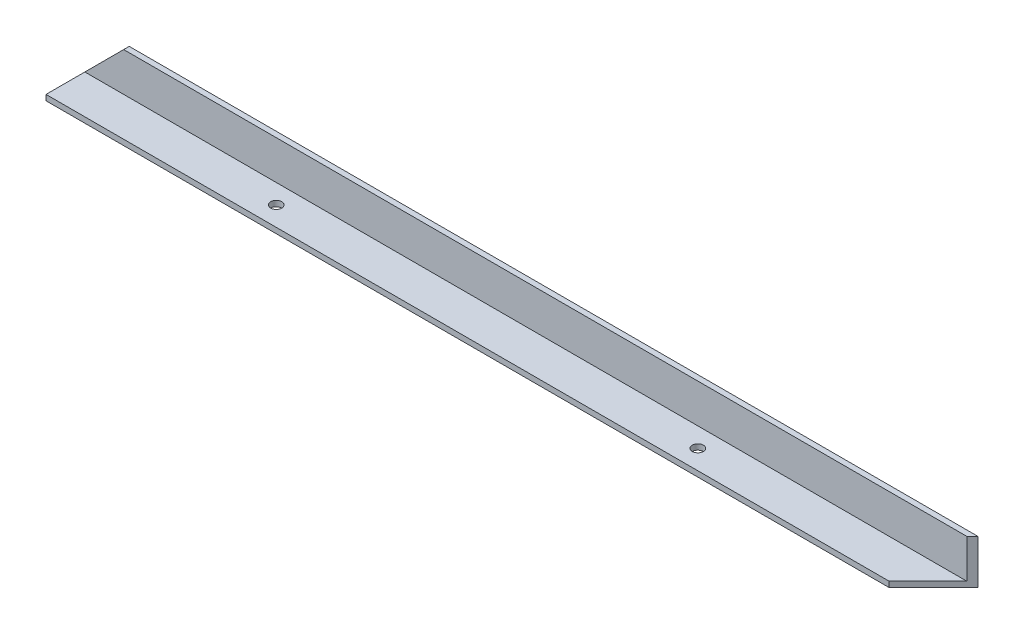
ISO-10303-21;
HEADER;
FILE_DESCRIPTION(('STEP AP214'),'2;1');
FILE_NAME('part.step','',(''),(''),'','','');
FILE_SCHEMA(('AUTOMOTIVE_DESIGN { 1 0 10303 214 1 1 1 1 }'));
ENDSEC;
DATA;
#1=APPLICATION_CONTEXT('core data for automotive mechanical design processes');
#2=APPLICATION_PROTOCOL_DEFINITION('international standard','automotive_design',2000,#1);
#3=PRODUCT_CONTEXT('',#1,'mechanical');
#4=PRODUCT('Part','Part','',(#3));
#5=PRODUCT_RELATED_PRODUCT_CATEGORY('part','',(#4));
#6=PRODUCT_DEFINITION_FORMATION('','',#4);
#7=PRODUCT_DEFINITION_CONTEXT('part definition',#1,'design');
#8=PRODUCT_DEFINITION('design','',#6,#7);
#9=PRODUCT_DEFINITION_SHAPE('','',#8);
#10=(LENGTH_UNIT() NAMED_UNIT(*) SI_UNIT(.MILLI.,.METRE.));
#11=(NAMED_UNIT(*) PLANE_ANGLE_UNIT() SI_UNIT($,.RADIAN.));
#12=(NAMED_UNIT(*) SI_UNIT($,.STERADIAN.) SOLID_ANGLE_UNIT());
#13=UNCERTAINTY_MEASURE_WITH_UNIT(LENGTH_MEASURE(1.E-05),#10,'distance_accuracy_value','');
#14=(GEOMETRIC_REPRESENTATION_CONTEXT(3) GLOBAL_UNCERTAINTY_ASSIGNED_CONTEXT((#13)) GLOBAL_UNIT_ASSIGNED_CONTEXT((#10,
#11,#12)) REPRESENTATION_CONTEXT('',''));
#15=CARTESIAN_POINT('',(0.,0.,0.));
#16=DIRECTION('',(0.,0.,1.));
#17=DIRECTION('',(1.,0.,0.));
#18=AXIS2_PLACEMENT_3D('',#15,#16,#17);
#19=CARTESIAN_POINT('',(0.,3.175,0.));
#20=DIRECTION('',(0.,-1.,0.));
#21=DIRECTION('',(0.,0.,-1.));
#22=AXIS2_PLACEMENT_3D('',#19,#20,#21);
#23=PLANE('',#22);
#24=CARTESIAN_POINT('',(-387.35,3.175,14.2875));
#25=DIRECTION('',(0.,1.,0.));
#26=DIRECTION('',(0.,0.,-1.));
#27=AXIS2_PLACEMENT_3D('',#24,#25,#26);
#28=CIRCLE('',#27,3.17499999999997);
#29=CARTESIAN_POINT('',(-387.35,3.175,11.1125));
#30=VERTEX_POINT('',#29);
#31=EDGE_CURVE('E158',#30,#30,#28,.T.);
#32=ORIENTED_EDGE('',*,*,#31,.F.);
#33=EDGE_LOOP('',(#32));
#34=FACE_BOUND('',#33,.T.);
#35=CARTESIAN_POINT('',(-146.05,3.175,14.2875));
#36=DIRECTION('',(0.,1.,0.));
#37=DIRECTION('',(0.,0.,1.));
#38=AXIS2_PLACEMENT_3D('',#35,#36,#37);
#39=CIRCLE('',#38,3.17499999999997);
#40=CARTESIAN_POINT('',(-146.05,3.175,17.4625));
#41=VERTEX_POINT('',#40);
#42=EDGE_CURVE('E152',#41,#41,#39,.T.);
#43=ORIENTED_EDGE('',*,*,#42,.F.);
#44=EDGE_LOOP('',(#43));
#45=FACE_BOUND('',#44,.T.);
#46=DIRECTION('',(1.,0.,0.));
#47=VECTOR('',#46,1.);
#48=CARTESIAN_POINT('',(0.,3.175,25.4));
#49=LINE('',#48,#47);
#50=CARTESIAN_POINT('',(-508.,3.175,25.4));
#51=VERTEX_POINT('',#50);
#52=CARTESIAN_POINT('',(-25.4000000000003,3.175,25.4));
#53=VERTEX_POINT('',#52);
#54=EDGE_CURVE('E124',#51,#53,#49,.T.);
#55=ORIENTED_EDGE('',*,*,#54,.T.);
#56=DIRECTION('',(0.707106781186551,0.,-0.707106781186544));
#57=VECTOR('',#56,1.);
#58=CARTESIAN_POINT('',(0.,3.175,0.));
#59=LINE('',#58,#57);
#60=CARTESIAN_POINT('',(-3.17500000000004,3.175,3.175));
#61=VERTEX_POINT('',#60);
#62=EDGE_CURVE('E143',#53,#61,#59,.T.);
#63=ORIENTED_EDGE('',*,*,#62,.T.);
#64=DIRECTION('',(1.,0.,0.));
#65=VECTOR('',#64,1.);
#66=CARTESIAN_POINT('',(-508.,3.175,3.175));
#67=LINE('',#66,#65);
#68=CARTESIAN_POINT('',(-508.,3.175,3.175));
#69=VERTEX_POINT('',#68);
#70=EDGE_CURVE('E130',#69,#61,#67,.T.);
#71=ORIENTED_EDGE('',*,*,#70,.F.);
#72=DIRECTION('',(0.,0.,1.));
#73=VECTOR('',#72,1.);
#74=CARTESIAN_POINT('',(-508.,3.175,0.));
#75=LINE('',#74,#73);
#76=EDGE_CURVE('E58',#69,#51,#75,.T.);
#77=ORIENTED_EDGE('',*,*,#76,.T.);
#78=EDGE_LOOP('',(#55,#63,#71,#77));
#79=FACE_BOUND('',#78,.T.);
#80=ADVANCED_FACE('F35',(#34,#45,#79),#23,.F.);
#81=CARTESIAN_POINT('',(0.,3.175,0.));
#82=DIRECTION('',(0.,0.,1.));
#83=DIRECTION('',(1.,0.,0.));
#84=AXIS2_PLACEMENT_3D('',#81,#82,#83);
#85=PLANE('',#84);
#86=DIRECTION('',(0.,-1.,0.));
#87=VECTOR('',#86,1.);
#88=CARTESIAN_POINT('',(-508.,3.175,0.));
#89=LINE('',#88,#87);
#90=CARTESIAN_POINT('',(-508.,3.175,0.));
#91=VERTEX_POINT('',#90);
#92=CARTESIAN_POINT('',(-508.,0.,0.));
#93=VERTEX_POINT('',#92);
#94=EDGE_CURVE('E70',#91,#93,#89,.T.);
#95=ORIENTED_EDGE('',*,*,#94,.F.);
#96=DIRECTION('',(-0.707106781186547,-0.707106781186548,0.));
#97=VECTOR('',#96,1.);
#98=CARTESIAN_POINT('',(-508.,3.175,0.));
#99=LINE('',#98,#97);
#100=CARTESIAN_POINT('',(-485.775,25.4,0.));
#101=VERTEX_POINT('',#100);
#102=EDGE_CURVE('E134',#101,#91,#99,.T.);
#103=ORIENTED_EDGE('',*,*,#102,.F.);
#104=DIRECTION('',(-1.,0.,0.));
#105=VECTOR('',#104,1.);
#106=CARTESIAN_POINT('',(-508.,25.4,0.));
#107=LINE('',#106,#105);
#108=CARTESIAN_POINT('',(0.,25.4,0.));
#109=VERTEX_POINT('',#108);
#110=EDGE_CURVE('E115',#109,#101,#107,.T.);
#111=ORIENTED_EDGE('',*,*,#110,.F.);
#112=DIRECTION('',(0.,-1.,0.));
#113=VECTOR('',#112,1.);
#114=CARTESIAN_POINT('',(0.,3.175,0.));
#115=LINE('',#114,#113);
#116=CARTESIAN_POINT('',(0.,0.,0.));
#117=VERTEX_POINT('',#116);
#118=EDGE_CURVE('E43',#109,#117,#115,.T.);
#119=ORIENTED_EDGE('',*,*,#118,.T.);
#120=DIRECTION('',(-1.,0.,0.));
#121=VECTOR('',#120,1.);
#122=CARTESIAN_POINT('',(0.,0.,0.));
#123=LINE('',#122,#121);
#124=EDGE_CURVE('E111',#117,#93,#123,.T.);
#125=ORIENTED_EDGE('',*,*,#124,.T.);
#126=EDGE_LOOP('',(#95,#103,#111,#119,#125));
#127=FACE_BOUND('',#126,.T.);
#128=ADVANCED_FACE('F37',(#127),#85,.F.);
#129=CARTESIAN_POINT('',(-508.,3.175,0.));
#130=DIRECTION('',(1.,0.,0.));
#131=DIRECTION('',(0.,0.,-1.));
#132=AXIS2_PLACEMENT_3D('',#129,#130,#131);
#133=PLANE('',#132);
#134=ORIENTED_EDGE('',*,*,#76,.F.);
#135=DIRECTION('',(0.,0.,1.));
#136=VECTOR('',#135,1.);
#137=CARTESIAN_POINT('',(-508.,3.175,-73.2494179189343));
#138=LINE('',#137,#136);
#139=EDGE_CURVE('E139',#91,#69,#138,.T.);
#140=ORIENTED_EDGE('',*,*,#139,.F.);
#141=ORIENTED_EDGE('',*,*,#94,.T.);
#142=DIRECTION('',(0.,0.,1.));
#143=VECTOR('',#142,1.);
#144=CARTESIAN_POINT('',(-508.,0.,0.));
#145=LINE('',#144,#143);
#146=CARTESIAN_POINT('',(-508.,0.,25.4));
#147=VERTEX_POINT('',#146);
#148=EDGE_CURVE('E113',#93,#147,#145,.T.);
#149=ORIENTED_EDGE('',*,*,#148,.T.);
#150=DIRECTION('',(0.,-1.,0.));
#151=VECTOR('',#150,1.);
#152=CARTESIAN_POINT('',(-508.,3.175,25.4));
#153=LINE('',#152,#151);
#154=EDGE_CURVE('E119',#51,#147,#153,.T.);
#155=ORIENTED_EDGE('',*,*,#154,.F.);
#156=EDGE_LOOP('',(#134,#140,#141,#149,#155));
#157=FACE_BOUND('',#156,.T.);
#158=ADVANCED_FACE('F172',(#157),#133,.F.);
#159=CARTESIAN_POINT('',(0.,3.175,25.4));
#160=DIRECTION('',(0.,0.,-1.));
#161=DIRECTION('',(-1.,0.,0.));
#162=AXIS2_PLACEMENT_3D('',#159,#160,#161);
#163=PLANE('',#162);
#164=DIRECTION('',(1.,0.,0.));
#165=VECTOR('',#164,1.);
#166=CARTESIAN_POINT('',(0.,0.,25.4));
#167=LINE('',#166,#165);
#168=CARTESIAN_POINT('',(-25.4000000000003,0.,25.4));
#169=VERTEX_POINT('',#168);
#170=EDGE_CURVE('E125',#147,#169,#167,.T.);
#171=ORIENTED_EDGE('',*,*,#170,.T.);
#172=DIRECTION('',(0.,1.,0.));
#173=VECTOR('',#172,1.);
#174=CARTESIAN_POINT('',(-25.4000000000002,3.175,25.4));
#175=LINE('',#174,#173);
#176=EDGE_CURVE('E103',#169,#53,#175,.T.);
#177=ORIENTED_EDGE('',*,*,#176,.T.);
#178=ORIENTED_EDGE('',*,*,#54,.F.);
#179=ORIENTED_EDGE('',*,*,#154,.T.);
#180=EDGE_LOOP('',(#171,#177,#178,#179));
#181=FACE_BOUND('',#180,.T.);
#182=ADVANCED_FACE('F171',(#181),#163,.F.);
#183=CARTESIAN_POINT('',(0.,0.,0.));
#184=DIRECTION('',(0.,-1.,0.));
#185=DIRECTION('',(0.,0.,-1.));
#186=AXIS2_PLACEMENT_3D('',#183,#184,#185);
#187=PLANE('',#186);
#188=CARTESIAN_POINT('',(-387.35,0.,14.2875));
#189=DIRECTION('',(0.,-1.,0.));
#190=DIRECTION('',(0.,0.,-1.));
#191=AXIS2_PLACEMENT_3D('',#188,#189,#190);
#192=CIRCLE('',#191,3.17499999999997);
#193=CARTESIAN_POINT('',(-387.35,0.,11.1125));
#194=VERTEX_POINT('',#193);
#195=EDGE_CURVE('E155',#194,#194,#192,.F.);
#196=ORIENTED_EDGE('',*,*,#195,.T.);
#197=EDGE_LOOP('',(#196));
#198=FACE_BOUND('',#197,.T.);
#199=CARTESIAN_POINT('',(-146.05,0.,14.2875));
#200=DIRECTION('',(0.,-1.,0.));
#201=DIRECTION('',(0.,0.,-1.));
#202=AXIS2_PLACEMENT_3D('',#199,#200,#201);
#203=CIRCLE('',#202,3.17499999999997);
#204=CARTESIAN_POINT('',(-146.05,0.,11.1125));
#205=VERTEX_POINT('',#204);
#206=EDGE_CURVE('E149',#205,#205,#203,.F.);
#207=ORIENTED_EDGE('',*,*,#206,.T.);
#208=EDGE_LOOP('',(#207));
#209=FACE_BOUND('',#208,.T.);
#210=DIRECTION('',(-0.707106781186551,0.,0.707106781186544));
#211=VECTOR('',#210,1.);
#212=CARTESIAN_POINT('',(0.,0.,0.));
#213=LINE('',#212,#211);
#214=EDGE_CURVE('E99',#117,#169,#213,.T.);
#215=ORIENTED_EDGE('',*,*,#214,.T.);
#216=ORIENTED_EDGE('',*,*,#170,.F.);
#217=ORIENTED_EDGE('',*,*,#148,.F.);
#218=ORIENTED_EDGE('',*,*,#124,.F.);
#219=EDGE_LOOP('',(#215,#216,#217,#218));
#220=FACE_BOUND('',#219,.T.);
#221=ADVANCED_FACE('F112',(#198,#209,#220),#187,.T.);
#222=CARTESIAN_POINT('',(-508.,25.4,3.175));
#223=DIRECTION('',(0.,0.,-1.));
#224=DIRECTION('',(-1.,0.,0.));
#225=AXIS2_PLACEMENT_3D('',#222,#223,#224);
#226=PLANE('',#225);
#227=ORIENTED_EDGE('',*,*,#70,.T.);
#228=DIRECTION('',(0.,1.,0.));
#229=VECTOR('',#228,1.);
#230=CARTESIAN_POINT('',(-3.17500000000004,25.4,3.175));
#231=LINE('',#230,#229);
#232=CARTESIAN_POINT('',(-3.17500000000003,25.4,3.175));
#233=VERTEX_POINT('',#232);
#234=EDGE_CURVE('E107',#61,#233,#231,.T.);
#235=ORIENTED_EDGE('',*,*,#234,.T.);
#236=DIRECTION('',(1.,0.,0.));
#237=VECTOR('',#236,1.);
#238=CARTESIAN_POINT('',(-508.,25.4,3.175));
#239=LINE('',#238,#237);
#240=CARTESIAN_POINT('',(-485.775,25.4,3.175));
#241=VERTEX_POINT('',#240);
#242=EDGE_CURVE('E133',#241,#233,#239,.T.);
#243=ORIENTED_EDGE('',*,*,#242,.F.);
#244=DIRECTION('',(0.707106781186547,0.707106781186548,0.));
#245=VECTOR('',#244,1.);
#246=CARTESIAN_POINT('',(-508.,3.175,3.175));
#247=LINE('',#246,#245);
#248=EDGE_CURVE('E49',#69,#241,#247,.T.);
#249=ORIENTED_EDGE('',*,*,#248,.F.);
#250=EDGE_LOOP('',(#227,#235,#243,#249));
#251=FACE_BOUND('',#250,.T.);
#252=ADVANCED_FACE('F177',(#251),#226,.F.);
#253=CARTESIAN_POINT('',(0.,25.4,0.));
#254=DIRECTION('',(0.,1.,0.));
#255=DIRECTION('',(0.,0.,1.));
#256=AXIS2_PLACEMENT_3D('',#253,#254,#255);
#257=PLANE('',#256);
#258=DIRECTION('',(-0.707106781186551,0.,0.707106781186544));
#259=VECTOR('',#258,1.);
#260=CARTESIAN_POINT('',(0.,25.4,0.));
#261=LINE('',#260,#259);
#262=EDGE_CURVE('E108',#109,#233,#261,.T.);
#263=ORIENTED_EDGE('',*,*,#262,.F.);
#264=ORIENTED_EDGE('',*,*,#110,.T.);
#265=DIRECTION('',(0.,0.,-1.));
#266=VECTOR('',#265,1.);
#267=CARTESIAN_POINT('',(-485.775,25.4,0.));
#268=LINE('',#267,#266);
#269=EDGE_CURVE('E11',#241,#101,#268,.T.);
#270=ORIENTED_EDGE('',*,*,#269,.F.);
#271=ORIENTED_EDGE('',*,*,#242,.T.);
#272=EDGE_LOOP('',(#263,#264,#270,#271));
#273=FACE_BOUND('',#272,.T.);
#274=ADVANCED_FACE('F174',(#273),#257,.T.);
#275=CARTESIAN_POINT('',(-508.,3.175,-73.2494179189343));
#276=DIRECTION('',(0.707106781186548,-0.707106781186547,0.));
#277=DIRECTION('',(0.707106781186547,0.707106781186548,0.));
#278=AXIS2_PLACEMENT_3D('',#275,#276,#277);
#279=PLANE('',#278);
#280=ORIENTED_EDGE('',*,*,#269,.T.);
#281=ORIENTED_EDGE('',*,*,#102,.T.);
#282=ORIENTED_EDGE('',*,*,#139,.T.);
#283=ORIENTED_EDGE('',*,*,#248,.T.);
#284=EDGE_LOOP('',(#280,#281,#282,#283));
#285=FACE_BOUND('',#284,.T.);
#286=ADVANCED_FACE('F184',(#285),#279,.F.);
#287=CARTESIAN_POINT('',(0.,-114.523507228448,0.));
#288=DIRECTION('',(-0.707106781186544,0.,-0.707106781186551));
#289=DIRECTION('',(-0.707106781186551,0.,0.707106781186544));
#290=AXIS2_PLACEMENT_3D('',#287,#288,#289);
#291=PLANE('',#290);
#292=ORIENTED_EDGE('',*,*,#214,.F.);
#293=ORIENTED_EDGE('',*,*,#118,.F.);
#294=ORIENTED_EDGE('',*,*,#262,.T.);
#295=ORIENTED_EDGE('',*,*,#234,.F.);
#296=ORIENTED_EDGE('',*,*,#62,.F.);
#297=ORIENTED_EDGE('',*,*,#176,.F.);
#298=EDGE_LOOP('',(#292,#293,#294,#295,#296,#297));
#299=FACE_BOUND('',#298,.T.);
#300=ADVANCED_FACE('F101',(#299),#291,.F.);
#301=CARTESIAN_POINT('',(-146.05,-8.98025612106909,14.2875));
#302=DIRECTION('',(0.,1.,0.));
#303=DIRECTION('',(0.,0.,1.));
#304=AXIS2_PLACEMENT_3D('',#301,#302,#303);
#305=CYLINDRICAL_SURFACE('',#304,3.17499999999997);
#306=ORIENTED_EDGE('',*,*,#42,.T.);
#307=EDGE_LOOP('',(#306));
#308=FACE_BOUND('',#307,.T.);
#309=ORIENTED_EDGE('',*,*,#206,.F.);
#310=EDGE_LOOP('',(#309));
#311=FACE_BOUND('',#310,.T.);
#312=ADVANCED_FACE('F217',(#308,#311),#305,.F.);
#313=CARTESIAN_POINT('',(-387.35,-8.98025612106909,14.2875));
#314=DIRECTION('',(0.,1.,0.));
#315=DIRECTION('',(0.,0.,1.));
#316=AXIS2_PLACEMENT_3D('',#313,#314,#315);
#317=CYLINDRICAL_SURFACE('',#316,3.17499999999997);
#318=ORIENTED_EDGE('',*,*,#31,.T.);
#319=EDGE_LOOP('',(#318));
#320=FACE_BOUND('',#319,.T.);
#321=ORIENTED_EDGE('',*,*,#195,.F.);
#322=EDGE_LOOP('',(#321));
#323=FACE_BOUND('',#322,.T.);
#324=ADVANCED_FACE('F162',(#320,#323),#317,.F.);
#325=CLOSED_SHELL('',(#80,#128,#158,#182,#221,#252,#274,#286,#300,#312,#324));
#326=MANIFOLD_SOLID_BREP('B2',#325);
#327=ADVANCED_BREP_SHAPE_REPRESENTATION('',(#18,#326),#14);
#328=SHAPE_DEFINITION_REPRESENTATION(#9,#327);
ENDSEC;
END-ISO-10303-21;
